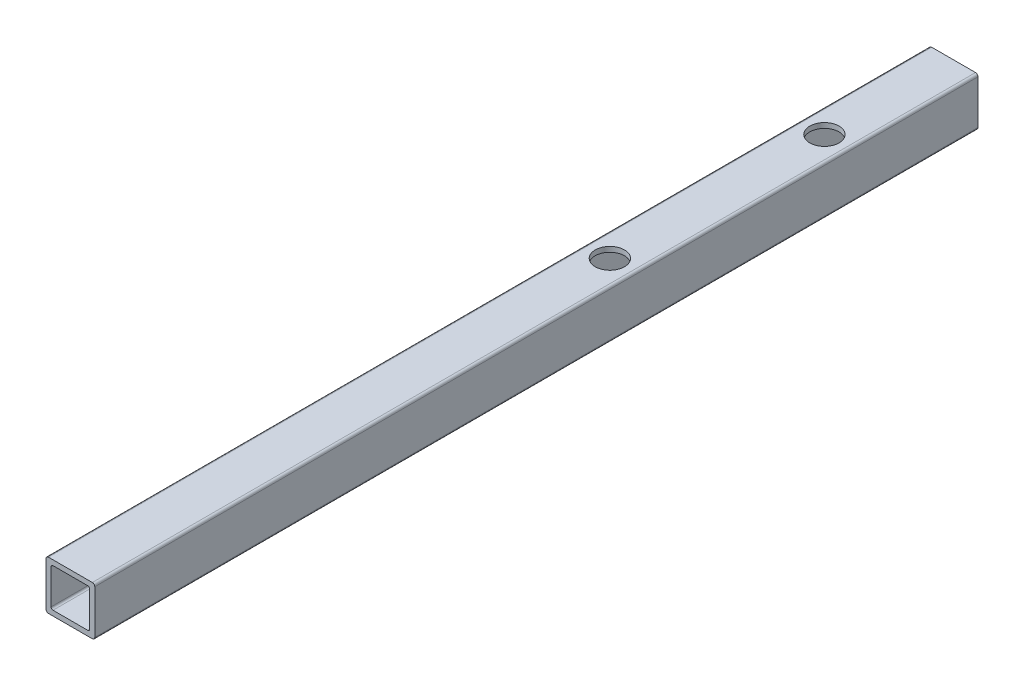
ISO-10303-21;
HEADER;
FILE_DESCRIPTION(('STEP AP214'),'2;1');
FILE_NAME('part.step','',(''),(''),'','','');
FILE_SCHEMA(('AUTOMOTIVE_DESIGN { 1 0 10303 214 1 1 1 1 }'));
ENDSEC;
DATA;
#1=APPLICATION_CONTEXT('core data for automotive mechanical design processes');
#2=APPLICATION_PROTOCOL_DEFINITION('international standard','automotive_design',2000,#1);
#3=PRODUCT_CONTEXT('',#1,'mechanical');
#4=PRODUCT('Part','Part','',(#3));
#5=PRODUCT_RELATED_PRODUCT_CATEGORY('part','',(#4));
#6=PRODUCT_DEFINITION_FORMATION('','',#4);
#7=PRODUCT_DEFINITION_CONTEXT('part definition',#1,'design');
#8=PRODUCT_DEFINITION('design','',#6,#7);
#9=PRODUCT_DEFINITION_SHAPE('','',#8);
#10=(LENGTH_UNIT() NAMED_UNIT(*) SI_UNIT(.MILLI.,.METRE.));
#11=(NAMED_UNIT(*) PLANE_ANGLE_UNIT() SI_UNIT($,.RADIAN.));
#12=(NAMED_UNIT(*) SI_UNIT($,.STERADIAN.) SOLID_ANGLE_UNIT());
#13=UNCERTAINTY_MEASURE_WITH_UNIT(LENGTH_MEASURE(1.E-05),#10,'distance_accuracy_value','');
#14=(GEOMETRIC_REPRESENTATION_CONTEXT(3) GLOBAL_UNCERTAINTY_ASSIGNED_CONTEXT((#13)) GLOBAL_UNIT_ASSIGNED_CONTEXT((#10,
#11,#12)) REPRESENTATION_CONTEXT('',''));
#15=CARTESIAN_POINT('',(0.,0.,0.));
#16=DIRECTION('',(0.,0.,1.));
#17=DIRECTION('',(1.,0.,0.));
#18=AXIS2_PLACEMENT_3D('',#15,#16,#17);
#19=CARTESIAN_POINT('',(7.14375,-7.14375,457.2));
#20=DIRECTION('',(0.,0.,-1.));
#21=DIRECTION('',(-1.,0.,0.));
#22=AXIS2_PLACEMENT_3D('',#19,#20,#21);
#23=CYLINDRICAL_SURFACE('',#22,0.79375);
#24=DIRECTION('',(0.,0.,-1.));
#25=VECTOR('',#24,1.);
#26=CARTESIAN_POINT('',(7.93749999999999,-7.14375,457.2));
#27=LINE('',#26,#25);
#28=CARTESIAN_POINT('',(7.93749999999999,-7.14375,-169.633508701963));
#29=VERTEX_POINT('',#28);
#30=CARTESIAN_POINT('',(7.93749999999999,-7.14375,-457.2));
#31=VERTEX_POINT('',#30);
#32=EDGE_CURVE('E41',#29,#31,#27,.T.);
#33=ORIENTED_EDGE('',*,*,#32,.F.);
#34=CARTESIAN_POINT('',(7.14375,-7.14375,-169.633508701963));
#35=DIRECTION('',(0.,0.,-1.));
#36=DIRECTION('',(-1.,0.,0.));
#37=AXIS2_PLACEMENT_3D('',#34,#35,#36);
#38=CIRCLE('',#37,0.79375);
#39=CARTESIAN_POINT('',(7.14375,-7.9375,-169.633508701963));
#40=VERTEX_POINT('',#39);
#41=EDGE_CURVE('E284',#29,#40,#38,.T.);
#42=ORIENTED_EDGE('',*,*,#41,.T.);
#43=DIRECTION('',(0.,0.,-1.));
#44=VECTOR('',#43,1.);
#45=CARTESIAN_POINT('',(7.14375,-7.9375,457.2));
#46=LINE('',#45,#44);
#47=CARTESIAN_POINT('',(7.14375,-7.9375,-457.2));
#48=VERTEX_POINT('',#47);
#49=EDGE_CURVE('E266',#40,#48,#46,.T.);
#50=ORIENTED_EDGE('',*,*,#49,.T.);
#51=CARTESIAN_POINT('',(7.14375,-7.14375,-457.2));
#52=DIRECTION('',(0.,0.,1.));
#53=DIRECTION('',(1.,0.,0.));
#54=AXIS2_PLACEMENT_3D('',#51,#52,#53);
#55=CIRCLE('',#54,0.79375);
#56=EDGE_CURVE('E229',#48,#31,#55,.T.);
#57=ORIENTED_EDGE('',*,*,#56,.T.);
#58=EDGE_LOOP('',(#33,#42,#50,#57));
#59=FACE_BOUND('',#58,.T.);
#60=ADVANCED_FACE('F34',(#59),#23,.T.);
#61=CARTESIAN_POINT('',(7.93749999999999,-7.14375,457.2));
#62=DIRECTION('',(-1.,0.,0.));
#63=DIRECTION('',(0.,0.,1.));
#64=AXIS2_PLACEMENT_3D('',#61,#62,#63);
#65=PLANE('',#64);
#66=DIRECTION('',(0.,0.,-1.));
#67=VECTOR('',#66,1.);
#68=CARTESIAN_POINT('',(7.93749999999999,7.14375,457.2));
#69=LINE('',#68,#67);
#70=CARTESIAN_POINT('',(7.93749999999999,7.14375,-169.633508701963));
#71=VERTEX_POINT('',#70);
#72=CARTESIAN_POINT('',(7.93749999999999,7.14375,-457.2));
#73=VERTEX_POINT('',#72);
#74=EDGE_CURVE('E176',#71,#73,#69,.T.);
#75=ORIENTED_EDGE('',*,*,#74,.F.);
#76=DIRECTION('',(0.,-1.,0.));
#77=VECTOR('',#76,1.);
#78=CARTESIAN_POINT('',(7.93749999999999,-7.14375,-169.633508701963));
#79=LINE('',#78,#77);
#80=EDGE_CURVE('E286',#71,#29,#79,.T.);
#81=ORIENTED_EDGE('',*,*,#80,.T.);
#82=ORIENTED_EDGE('',*,*,#32,.T.);
#83=DIRECTION('',(0.,1.,0.));
#84=VECTOR('',#83,1.);
#85=CARTESIAN_POINT('',(7.93749999999999,-7.14375,-457.2));
#86=LINE('',#85,#84);
#87=EDGE_CURVE('E232',#31,#73,#86,.T.);
#88=ORIENTED_EDGE('',*,*,#87,.T.);
#89=EDGE_LOOP('',(#75,#81,#82,#88));
#90=FACE_BOUND('',#89,.T.);
#91=ADVANCED_FACE('F303',(#90),#65,.F.);
#92=CARTESIAN_POINT('',(7.14375,7.14375,457.2));
#93=DIRECTION('',(0.,0.,-1.));
#94=DIRECTION('',(-1.,0.,0.));
#95=AXIS2_PLACEMENT_3D('',#92,#93,#94);
#96=CYLINDRICAL_SURFACE('',#95,0.79375);
#97=DIRECTION('',(0.,0.,-1.));
#98=VECTOR('',#97,1.);
#99=CARTESIAN_POINT('',(7.14375,7.9375,457.2));
#100=LINE('',#99,#98);
#101=CARTESIAN_POINT('',(7.14375,7.9375,-169.633508701963));
#102=VERTEX_POINT('',#101);
#103=CARTESIAN_POINT('',(7.14375,7.9375,-457.2));
#104=VERTEX_POINT('',#103);
#105=EDGE_CURVE('E169',#102,#104,#100,.T.);
#106=ORIENTED_EDGE('',*,*,#105,.F.);
#107=CARTESIAN_POINT('',(7.14375,7.14375,-169.633508701963));
#108=DIRECTION('',(0.,0.,-1.));
#109=DIRECTION('',(-1.,0.,0.));
#110=AXIS2_PLACEMENT_3D('',#107,#108,#109);
#111=CIRCLE('',#110,0.79375);
#112=EDGE_CURVE('E288',#102,#71,#111,.T.);
#113=ORIENTED_EDGE('',*,*,#112,.T.);
#114=ORIENTED_EDGE('',*,*,#74,.T.);
#115=CARTESIAN_POINT('',(7.14375,7.14375,-457.2));
#116=DIRECTION('',(0.,0.,1.));
#117=DIRECTION('',(1.,0.,0.));
#118=AXIS2_PLACEMENT_3D('',#115,#116,#117);
#119=CIRCLE('',#118,0.79375);
#120=EDGE_CURVE('E235',#73,#104,#119,.T.);
#121=ORIENTED_EDGE('',*,*,#120,.T.);
#122=EDGE_LOOP('',(#106,#113,#114,#121));
#123=FACE_BOUND('',#122,.T.);
#124=ADVANCED_FACE('F300',(#123),#96,.T.);
#125=CARTESIAN_POINT('',(7.14375,7.9375,457.2));
#126=DIRECTION('',(0.,-1.,0.));
#127=DIRECTION('',(0.,0.,-1.));
#128=AXIS2_PLACEMENT_3D('',#125,#126,#127);
#129=PLANE('',#128);
#130=CARTESIAN_POINT('',(7.21644966006352E-13,7.9375,-345.28125));
#131=DIRECTION('',(0.,1.,0.));
#132=DIRECTION('',(0.,0.,1.));
#133=AXIS2_PLACEMENT_3D('',#130,#131,#132);
#134=CIRCLE('',#133,4.76249999999999);
#135=CARTESIAN_POINT('',(7.21644966006352E-13,7.9375,-340.51875));
#136=VERTEX_POINT('',#135);
#137=EDGE_CURVE('E152',#136,#136,#134,.T.);
#138=ORIENTED_EDGE('',*,*,#137,.F.);
#139=EDGE_LOOP('',(#138));
#140=FACE_BOUND('',#139,.T.);
#141=CARTESIAN_POINT('',(0.,7.9375,-415.13125));
#142=DIRECTION('',(0.,-1.,0.));
#143=DIRECTION('',(0.,0.,-1.));
#144=AXIS2_PLACEMENT_3D('',#141,#142,#143);
#145=CIRCLE('',#144,4.7625);
#146=CARTESIAN_POINT('',(0.,7.9375,-419.89375));
#147=VERTEX_POINT('',#146);
#148=EDGE_CURVE('E196',#147,#147,#145,.T.);
#149=ORIENTED_EDGE('',*,*,#148,.T.);
#150=EDGE_LOOP('',(#149));
#151=FACE_BOUND('',#150,.T.);
#152=DIRECTION('',(0.,0.,-1.));
#153=VECTOR('',#152,1.);
#154=CARTESIAN_POINT('',(-7.14375,7.9375,457.2));
#155=LINE('',#154,#153);
#156=CARTESIAN_POINT('',(-7.14375,7.9375,-169.633508701963));
#157=VERTEX_POINT('',#156);
#158=CARTESIAN_POINT('',(-7.14375,7.9375,-457.2));
#159=VERTEX_POINT('',#158);
#160=EDGE_CURVE('E167',#157,#159,#155,.T.);
#161=ORIENTED_EDGE('',*,*,#160,.F.);
#162=DIRECTION('',(1.,0.,0.));
#163=VECTOR('',#162,1.);
#164=CARTESIAN_POINT('',(7.14375,7.9375,-169.633508701963));
#165=LINE('',#164,#163);
#166=EDGE_CURVE('E148',#157,#102,#165,.T.);
#167=ORIENTED_EDGE('',*,*,#166,.T.);
#168=ORIENTED_EDGE('',*,*,#105,.T.);
#169=DIRECTION('',(-1.,0.,0.));
#170=VECTOR('',#169,1.);
#171=CARTESIAN_POINT('',(7.14375,7.9375,-457.2));
#172=LINE('',#171,#170);
#173=EDGE_CURVE('E238',#104,#159,#172,.T.);
#174=ORIENTED_EDGE('',*,*,#173,.T.);
#175=EDGE_LOOP('',(#161,#167,#168,#174));
#176=FACE_BOUND('',#175,.T.);
#177=ADVANCED_FACE('F297',(#140,#151,#176),#129,.F.);
#178=CARTESIAN_POINT('',(-7.14375,7.14375,457.2));
#179=DIRECTION('',(0.,0.,-1.));
#180=DIRECTION('',(-1.,0.,0.));
#181=AXIS2_PLACEMENT_3D('',#178,#179,#180);
#182=CYLINDRICAL_SURFACE('',#181,0.793749999999999);
#183=DIRECTION('',(0.,0.,-1.));
#184=VECTOR('',#183,1.);
#185=CARTESIAN_POINT('',(-7.93750000000001,7.14375,457.2));
#186=LINE('',#185,#184);
#187=CARTESIAN_POINT('',(-7.93750000000001,7.14375,-169.633508701963));
#188=VERTEX_POINT('',#187);
#189=CARTESIAN_POINT('',(-7.93750000000001,7.14375,-457.2));
#190=VERTEX_POINT('',#189);
#191=EDGE_CURVE('E158',#188,#190,#186,.T.);
#192=ORIENTED_EDGE('',*,*,#191,.F.);
#193=CARTESIAN_POINT('',(-7.14375,7.14375,-169.633508701963));
#194=DIRECTION('',(0.,0.,-1.));
#195=DIRECTION('',(-1.,0.,0.));
#196=AXIS2_PLACEMENT_3D('',#193,#194,#195);
#197=CIRCLE('',#196,0.793749999999999);
#198=EDGE_CURVE('E143',#188,#157,#197,.T.);
#199=ORIENTED_EDGE('',*,*,#198,.T.);
#200=ORIENTED_EDGE('',*,*,#160,.T.);
#201=CARTESIAN_POINT('',(-7.14375,7.14375,-457.2));
#202=DIRECTION('',(0.,0.,1.));
#203=DIRECTION('',(1.,0.,0.));
#204=AXIS2_PLACEMENT_3D('',#201,#202,#203);
#205=CIRCLE('',#204,0.793749999999999);
#206=EDGE_CURVE('E166',#159,#190,#205,.T.);
#207=ORIENTED_EDGE('',*,*,#206,.T.);
#208=EDGE_LOOP('',(#192,#199,#200,#207));
#209=FACE_BOUND('',#208,.T.);
#210=ADVANCED_FACE('F164',(#209),#182,.T.);
#211=CARTESIAN_POINT('',(-7.93750000000001,-7.14375,457.2));
#212=DIRECTION('',(1.,0.,0.));
#213=DIRECTION('',(0.,0.,-1.));
#214=AXIS2_PLACEMENT_3D('',#211,#212,#213);
#215=PLANE('',#214);
#216=DIRECTION('',(0.,0.,-1.));
#217=VECTOR('',#216,1.);
#218=CARTESIAN_POINT('',(-7.93750000000001,-7.14375,457.2));
#219=LINE('',#218,#217);
#220=CARTESIAN_POINT('',(-7.93750000000001,-7.14375,-169.633508701963));
#221=VERTEX_POINT('',#220);
#222=CARTESIAN_POINT('',(-7.93750000000001,-7.14375,-457.2));
#223=VERTEX_POINT('',#222);
#224=EDGE_CURVE('E160',#221,#223,#219,.T.);
#225=ORIENTED_EDGE('',*,*,#224,.F.);
#226=DIRECTION('',(0.,-1.,0.));
#227=VECTOR('',#226,1.);
#228=CARTESIAN_POINT('',(-7.93750000000001,40.902895141827,-169.633508701963));
#229=LINE('',#228,#227);
#230=EDGE_CURVE('E146',#188,#221,#229,.T.);
#231=ORIENTED_EDGE('',*,*,#230,.F.);
#232=ORIENTED_EDGE('',*,*,#191,.T.);
#233=DIRECTION('',(0.,-1.,0.));
#234=VECTOR('',#233,1.);
#235=CARTESIAN_POINT('',(-7.93750000000001,-7.14375,-457.2));
#236=LINE('',#235,#234);
#237=EDGE_CURVE('E242',#190,#223,#236,.T.);
#238=ORIENTED_EDGE('',*,*,#237,.T.);
#239=EDGE_LOOP('',(#225,#231,#232,#238));
#240=FACE_BOUND('',#239,.T.);
#241=ADVANCED_FACE('F156',(#240),#215,.F.);
#242=CARTESIAN_POINT('',(-7.14375,-7.14375,457.2));
#243=DIRECTION('',(0.,0.,-1.));
#244=DIRECTION('',(-1.,0.,0.));
#245=AXIS2_PLACEMENT_3D('',#242,#243,#244);
#246=CYLINDRICAL_SURFACE('',#245,0.793749999999999);
#247=DIRECTION('',(0.,0.,-1.));
#248=VECTOR('',#247,1.);
#249=CARTESIAN_POINT('',(-7.14375,-7.9375,457.2));
#250=LINE('',#249,#248);
#251=CARTESIAN_POINT('',(-7.14375,-7.9375,-169.633508701963));
#252=VERTEX_POINT('',#251);
#253=CARTESIAN_POINT('',(-7.14375,-7.9375,-457.2));
#254=VERTEX_POINT('',#253);
#255=EDGE_CURVE('E171',#252,#254,#250,.T.);
#256=ORIENTED_EDGE('',*,*,#255,.F.);
#257=CARTESIAN_POINT('',(-7.14375,-7.14375,-169.633508701963));
#258=DIRECTION('',(0.,0.,-1.));
#259=DIRECTION('',(-1.,0.,0.));
#260=AXIS2_PLACEMENT_3D('',#257,#258,#259);
#261=CIRCLE('',#260,0.793749999999999);
#262=EDGE_CURVE('E48',#252,#221,#261,.T.);
#263=ORIENTED_EDGE('',*,*,#262,.T.);
#264=ORIENTED_EDGE('',*,*,#224,.T.);
#265=CARTESIAN_POINT('',(-7.14375,-7.14375,-457.2));
#266=DIRECTION('',(0.,0.,1.));
#267=DIRECTION('',(1.,0.,0.));
#268=AXIS2_PLACEMENT_3D('',#265,#266,#267);
#269=CIRCLE('',#268,0.793749999999999);
#270=EDGE_CURVE('E244',#223,#254,#269,.T.);
#271=ORIENTED_EDGE('',*,*,#270,.T.);
#272=EDGE_LOOP('',(#256,#263,#264,#271));
#273=FACE_BOUND('',#272,.T.);
#274=ADVANCED_FACE('F275',(#273),#246,.T.);
#275=CARTESIAN_POINT('',(7.14375,-7.9375,457.2));
#276=DIRECTION('',(0.,1.,0.));
#277=DIRECTION('',(0.,0.,1.));
#278=AXIS2_PLACEMENT_3D('',#275,#276,#277);
#279=PLANE('',#278);
#280=CARTESIAN_POINT('',(7.21644966006352E-13,-7.9375,-345.28125));
#281=DIRECTION('',(0.,1.,0.));
#282=DIRECTION('',(0.,0.,1.));
#283=AXIS2_PLACEMENT_3D('',#280,#281,#282);
#284=CIRCLE('',#283,4.7625);
#285=CARTESIAN_POINT('',(7.21644966006352E-13,-7.9375,-340.51875));
#286=VERTEX_POINT('',#285);
#287=EDGE_CURVE('E181',#286,#286,#284,.T.);
#288=ORIENTED_EDGE('',*,*,#287,.T.);
#289=EDGE_LOOP('',(#288));
#290=FACE_BOUND('',#289,.T.);
#291=CARTESIAN_POINT('',(0.,-7.9375,-415.13125));
#292=DIRECTION('',(0.,-1.,0.));
#293=DIRECTION('',(0.,0.,-1.));
#294=AXIS2_PLACEMENT_3D('',#291,#292,#293);
#295=CIRCLE('',#294,4.76249999999999);
#296=CARTESIAN_POINT('',(0.,-7.9375,-419.89375));
#297=VERTEX_POINT('',#296);
#298=EDGE_CURVE('E185',#297,#297,#295,.T.);
#299=ORIENTED_EDGE('',*,*,#298,.F.);
#300=EDGE_LOOP('',(#299));
#301=FACE_BOUND('',#300,.T.);
#302=ORIENTED_EDGE('',*,*,#49,.F.);
#303=DIRECTION('',(-1.,0.,0.));
#304=VECTOR('',#303,1.);
#305=CARTESIAN_POINT('',(7.14375,-7.9375,-169.633508701963));
#306=LINE('',#305,#304);
#307=EDGE_CURVE('E272',#40,#252,#306,.T.);
#308=ORIENTED_EDGE('',*,*,#307,.T.);
#309=ORIENTED_EDGE('',*,*,#255,.T.);
#310=DIRECTION('',(1.,0.,0.));
#311=VECTOR('',#310,1.);
#312=CARTESIAN_POINT('',(7.14375,-7.9375,-457.2));
#313=LINE('',#312,#311);
#314=EDGE_CURVE('E247',#254,#48,#313,.T.);
#315=ORIENTED_EDGE('',*,*,#314,.T.);
#316=EDGE_LOOP('',(#302,#308,#309,#315));
#317=FACE_BOUND('',#316,.T.);
#318=ADVANCED_FACE('F270',(#290,#301,#317),#279,.F.);
#319=CARTESIAN_POINT('',(5.65784999999999,5.65785,457.2));
#320=DIRECTION('',(0.,0.,-1.));
#321=DIRECTION('',(-1.,0.,0.));
#322=AXIS2_PLACEMENT_3D('',#319,#320,#321);
#323=CYLINDRICAL_SURFACE('',#322,0.62865);
#324=CARTESIAN_POINT('',(5.65784999999999,5.65785,-169.633508701963));
#325=DIRECTION('',(0.,0.,-1.));
#326=DIRECTION('',(-1.,0.,0.));
#327=AXIS2_PLACEMENT_3D('',#324,#325,#326);
#328=CIRCLE('',#327,0.62865);
#329=CARTESIAN_POINT('',(5.65784999999999,6.2865,-169.633508701963));
#330=VERTEX_POINT('',#329);
#331=CARTESIAN_POINT('',(6.2865,5.65785,-169.633508701963));
#332=VERTEX_POINT('',#331);
#333=EDGE_CURVE('E55',#330,#332,#328,.T.);
#334=ORIENTED_EDGE('',*,*,#333,.F.);
#335=DIRECTION('',(0.,0.,-1.));
#336=VECTOR('',#335,1.);
#337=CARTESIAN_POINT('',(5.65784999999999,6.2865,457.2));
#338=LINE('',#337,#336);
#339=CARTESIAN_POINT('',(5.65784999999999,6.2865,-457.2));
#340=VERTEX_POINT('',#339);
#341=EDGE_CURVE('E264',#330,#340,#338,.T.);
#342=ORIENTED_EDGE('',*,*,#341,.T.);
#343=CARTESIAN_POINT('',(5.65784999999999,5.65785,-457.2));
#344=DIRECTION('',(0.,0.,1.));
#345=DIRECTION('',(1.,0.,0.));
#346=AXIS2_PLACEMENT_3D('',#343,#344,#345);
#347=CIRCLE('',#346,0.62865);
#348=CARTESIAN_POINT('',(6.2865,5.65785,-457.2));
#349=VERTEX_POINT('',#348);
#350=EDGE_CURVE('E205',#349,#340,#347,.T.);
#351=ORIENTED_EDGE('',*,*,#350,.F.);
#352=DIRECTION('',(0.,0.,-1.));
#353=VECTOR('',#352,1.);
#354=CARTESIAN_POINT('',(6.2865,5.65785,457.2));
#355=LINE('',#354,#353);
#356=EDGE_CURVE('E250',#332,#349,#355,.T.);
#357=ORIENTED_EDGE('',*,*,#356,.F.);
#358=EDGE_LOOP('',(#334,#342,#351,#357));
#359=FACE_BOUND('',#358,.T.);
#360=ADVANCED_FACE('F322',(#359),#323,.F.);
#361=CARTESIAN_POINT('',(5.65784999999999,6.2865,457.2));
#362=DIRECTION('',(0.,-1.,0.));
#363=DIRECTION('',(0.,0.,-1.));
#364=AXIS2_PLACEMENT_3D('',#361,#362,#363);
#365=PLANE('',#364);
#366=DIRECTION('',(1.,0.,0.));
#367=VECTOR('',#366,1.);
#368=CARTESIAN_POINT('',(5.65784999999999,6.2865,-169.633508701963));
#369=LINE('',#368,#367);
#370=CARTESIAN_POINT('',(-5.65784999999999,6.2865,-169.633508701963));
#371=VERTEX_POINT('',#370);
#372=EDGE_CURVE('E505',#371,#330,#369,.T.);
#373=ORIENTED_EDGE('',*,*,#372,.F.);
#374=DIRECTION('',(0.,0.,-1.));
#375=VECTOR('',#374,1.);
#376=CARTESIAN_POINT('',(-5.65784999999999,6.2865,457.2));
#377=LINE('',#376,#375);
#378=CARTESIAN_POINT('',(-5.65784999999999,6.2865,-457.2));
#379=VERTEX_POINT('',#378);
#380=EDGE_CURVE('E262',#371,#379,#377,.T.);
#381=ORIENTED_EDGE('',*,*,#380,.T.);
#382=DIRECTION('',(-1.,0.,0.));
#383=VECTOR('',#382,1.);
#384=CARTESIAN_POINT('',(5.65784999999999,6.2865,-457.2));
#385=LINE('',#384,#383);
#386=EDGE_CURVE('E208',#340,#379,#385,.T.);
#387=ORIENTED_EDGE('',*,*,#386,.F.);
#388=ORIENTED_EDGE('',*,*,#341,.F.);
#389=EDGE_LOOP('',(#373,#381,#387,#388));
#390=FACE_BOUND('',#389,.T.);
#391=CARTESIAN_POINT('',(7.21644966006352E-13,6.2865,-345.28125));
#392=DIRECTION('',(0.,-1.,0.));
#393=DIRECTION('',(0.,0.,-1.));
#394=AXIS2_PLACEMENT_3D('',#391,#392,#393);
#395=CIRCLE('',#394,4.76249999999999);
#396=CARTESIAN_POINT('',(7.21644966006352E-13,6.2865,-350.04375));
#397=VERTEX_POINT('',#396);
#398=EDGE_CURVE('E178',#397,#397,#395,.T.);
#399=ORIENTED_EDGE('',*,*,#398,.F.);
#400=EDGE_LOOP('',(#399));
#401=FACE_BOUND('',#400,.T.);
#402=CARTESIAN_POINT('',(0.,6.2865,-415.13125));
#403=DIRECTION('',(0.,-1.,0.));
#404=DIRECTION('',(0.,0.,-1.));
#405=AXIS2_PLACEMENT_3D('',#402,#403,#404);
#406=CIRCLE('',#405,4.76249999999999);
#407=CARTESIAN_POINT('',(0.,6.2865,-419.89375));
#408=VERTEX_POINT('',#407);
#409=EDGE_CURVE('E202',#408,#408,#406,.T.);
#410=ORIENTED_EDGE('',*,*,#409,.F.);
#411=EDGE_LOOP('',(#410));
#412=FACE_BOUND('',#411,.T.);
#413=ADVANCED_FACE('F325',(#390,#401,#412),#365,.T.);
#414=CARTESIAN_POINT('',(-5.65784999999999,5.65785,457.2));
#415=DIRECTION('',(0.,0.,-1.));
#416=DIRECTION('',(-1.,0.,0.));
#417=AXIS2_PLACEMENT_3D('',#414,#415,#416);
#418=CYLINDRICAL_SURFACE('',#417,0.628650000000002);
#419=CARTESIAN_POINT('',(-5.65784999999999,5.65785,-169.633508701963));
#420=DIRECTION('',(0.,0.,-1.));
#421=DIRECTION('',(-1.,0.,0.));
#422=AXIS2_PLACEMENT_3D('',#419,#420,#421);
#423=CIRCLE('',#422,0.628650000000002);
#424=CARTESIAN_POINT('',(-6.2865,5.65785,-169.633508701963));
#425=VERTEX_POINT('',#424);
#426=EDGE_CURVE('E486',#425,#371,#423,.T.);
#427=ORIENTED_EDGE('',*,*,#426,.F.);
#428=DIRECTION('',(0.,0.,-1.));
#429=VECTOR('',#428,1.);
#430=CARTESIAN_POINT('',(-6.2865,5.65785,457.2));
#431=LINE('',#430,#429);
#432=CARTESIAN_POINT('',(-6.2865,5.65785,-457.2));
#433=VERTEX_POINT('',#432);
#434=EDGE_CURVE('E260',#425,#433,#431,.T.);
#435=ORIENTED_EDGE('',*,*,#434,.T.);
#436=CARTESIAN_POINT('',(-5.65784999999999,5.65785,-457.2));
#437=DIRECTION('',(0.,0.,1.));
#438=DIRECTION('',(1.,0.,0.));
#439=AXIS2_PLACEMENT_3D('',#436,#437,#438);
#440=CIRCLE('',#439,0.628650000000002);
#441=EDGE_CURVE('E211',#379,#433,#440,.T.);
#442=ORIENTED_EDGE('',*,*,#441,.F.);
#443=ORIENTED_EDGE('',*,*,#380,.F.);
#444=EDGE_LOOP('',(#427,#435,#442,#443));
#445=FACE_BOUND('',#444,.T.);
#446=ADVANCED_FACE('F329',(#445),#418,.F.);
#447=CARTESIAN_POINT('',(-6.2865,5.65785,457.2));
#448=DIRECTION('',(1.,0.,0.));
#449=DIRECTION('',(0.,1.,0.));
#450=AXIS2_PLACEMENT_3D('',#447,#448,#449);
#451=PLANE('',#450);
#452=DIRECTION('',(0.,1.,0.));
#453=VECTOR('',#452,1.);
#454=CARTESIAN_POINT('',(-6.2865,5.65785,-169.633508701963));
#455=LINE('',#454,#453);
#456=CARTESIAN_POINT('',(-6.2865,-5.65785000000001,-169.633508701963));
#457=VERTEX_POINT('',#456);
#458=EDGE_CURVE('E490',#457,#425,#455,.T.);
#459=ORIENTED_EDGE('',*,*,#458,.F.);
#460=DIRECTION('',(0.,0.,-1.));
#461=VECTOR('',#460,1.);
#462=CARTESIAN_POINT('',(-6.2865,-5.65785000000001,457.2));
#463=LINE('',#462,#461);
#464=CARTESIAN_POINT('',(-6.2865,-5.65785000000001,-457.2));
#465=VERTEX_POINT('',#464);
#466=EDGE_CURVE('E258',#457,#465,#463,.T.);
#467=ORIENTED_EDGE('',*,*,#466,.T.);
#468=DIRECTION('',(0.,-1.,0.));
#469=VECTOR('',#468,1.);
#470=CARTESIAN_POINT('',(-6.2865,5.65785,-457.2));
#471=LINE('',#470,#469);
#472=EDGE_CURVE('E214',#433,#465,#471,.T.);
#473=ORIENTED_EDGE('',*,*,#472,.F.);
#474=ORIENTED_EDGE('',*,*,#434,.F.);
#475=EDGE_LOOP('',(#459,#467,#473,#474));
#476=FACE_BOUND('',#475,.T.);
#477=ADVANCED_FACE('F333',(#476),#451,.T.);
#478=CARTESIAN_POINT('',(-5.65784999999999,-5.65785000000001,457.2));
#479=DIRECTION('',(0.,0.,-1.));
#480=DIRECTION('',(-1.,0.,0.));
#481=AXIS2_PLACEMENT_3D('',#478,#479,#480);
#482=CYLINDRICAL_SURFACE('',#481,0.62865);
#483=CARTESIAN_POINT('',(-5.65784999999999,-5.65785000000001,-169.633508701963));
#484=DIRECTION('',(0.,0.,-1.));
#485=DIRECTION('',(-1.,0.,0.));
#486=AXIS2_PLACEMENT_3D('',#483,#484,#485);
#487=CIRCLE('',#486,0.62865);
#488=CARTESIAN_POINT('',(-5.65784999999999,-6.2865,-169.633508701963));
#489=VERTEX_POINT('',#488);
#490=EDGE_CURVE('E499',#489,#457,#487,.T.);
#491=ORIENTED_EDGE('',*,*,#490,.F.);
#492=DIRECTION('',(0.,0.,-1.));
#493=VECTOR('',#492,1.);
#494=CARTESIAN_POINT('',(-5.65784999999999,-6.2865,457.2));
#495=LINE('',#494,#493);
#496=CARTESIAN_POINT('',(-5.65784999999999,-6.2865,-457.2));
#497=VERTEX_POINT('',#496);
#498=EDGE_CURVE('E256',#489,#497,#495,.T.);
#499=ORIENTED_EDGE('',*,*,#498,.T.);
#500=CARTESIAN_POINT('',(-5.65784999999999,-5.65785000000001,-457.2));
#501=DIRECTION('',(0.,0.,1.));
#502=DIRECTION('',(1.,0.,0.));
#503=AXIS2_PLACEMENT_3D('',#500,#501,#502);
#504=CIRCLE('',#503,0.62865);
#505=EDGE_CURVE('E217',#465,#497,#504,.T.);
#506=ORIENTED_EDGE('',*,*,#505,.F.);
#507=ORIENTED_EDGE('',*,*,#466,.F.);
#508=EDGE_LOOP('',(#491,#499,#506,#507));
#509=FACE_BOUND('',#508,.T.);
#510=ADVANCED_FACE('F337',(#509),#482,.F.);
#511=CARTESIAN_POINT('',(5.65784999999999,-6.2865,457.2));
#512=DIRECTION('',(0.,1.,0.));
#513=DIRECTION('',(-1.,0.,0.));
#514=AXIS2_PLACEMENT_3D('',#511,#512,#513);
#515=PLANE('',#514);
#516=DIRECTION('',(-1.,0.,0.));
#517=VECTOR('',#516,1.);
#518=CARTESIAN_POINT('',(5.65784999999999,-6.2865,-169.633508701963));
#519=LINE('',#518,#517);
#520=CARTESIAN_POINT('',(5.65784999999999,-6.2865,-169.633508701963));
#521=VERTEX_POINT('',#520);
#522=EDGE_CURVE('E496',#521,#489,#519,.T.);
#523=ORIENTED_EDGE('',*,*,#522,.F.);
#524=DIRECTION('',(0.,0.,-1.));
#525=VECTOR('',#524,1.);
#526=CARTESIAN_POINT('',(5.65784999999999,-6.2865,457.2));
#527=LINE('',#526,#525);
#528=CARTESIAN_POINT('',(5.65784999999999,-6.2865,-457.2));
#529=VERTEX_POINT('',#528);
#530=EDGE_CURVE('E254',#521,#529,#527,.T.);
#531=ORIENTED_EDGE('',*,*,#530,.T.);
#532=DIRECTION('',(1.,0.,0.));
#533=VECTOR('',#532,1.);
#534=CARTESIAN_POINT('',(5.65784999999999,-6.2865,-457.2));
#535=LINE('',#534,#533);
#536=EDGE_CURVE('E220',#497,#529,#535,.T.);
#537=ORIENTED_EDGE('',*,*,#536,.F.);
#538=ORIENTED_EDGE('',*,*,#498,.F.);
#539=EDGE_LOOP('',(#523,#531,#537,#538));
#540=FACE_BOUND('',#539,.T.);
#541=CARTESIAN_POINT('',(7.21644966006352E-13,-6.2865,-345.28125));
#542=DIRECTION('',(0.,1.,0.));
#543=DIRECTION('',(-1.,0.,0.));
#544=AXIS2_PLACEMENT_3D('',#541,#542,#543);
#545=CIRCLE('',#544,4.76249999999999);
#546=CARTESIAN_POINT('',(-4.76249999999927,-6.2865,-345.28125));
#547=VERTEX_POINT('',#546);
#548=EDGE_CURVE('E180',#547,#547,#545,.T.);
#549=ORIENTED_EDGE('',*,*,#548,.F.);
#550=EDGE_LOOP('',(#549));
#551=FACE_BOUND('',#550,.T.);
#552=CARTESIAN_POINT('',(0.,-6.2865,-415.13125));
#553=DIRECTION('',(0.,1.,0.));
#554=DIRECTION('',(-1.,0.,0.));
#555=AXIS2_PLACEMENT_3D('',#552,#553,#554);
#556=CIRCLE('',#555,4.76249999999999);
#557=CARTESIAN_POINT('',(-4.76249999999999,-6.2865,-415.13125));
#558=VERTEX_POINT('',#557);
#559=EDGE_CURVE('E199',#558,#558,#556,.T.);
#560=ORIENTED_EDGE('',*,*,#559,.F.);
#561=EDGE_LOOP('',(#560));
#562=FACE_BOUND('',#561,.T.);
#563=ADVANCED_FACE('F341',(#540,#551,#562),#515,.T.);
#564=CARTESIAN_POINT('',(5.65784999999999,-5.65785000000001,457.2));
#565=DIRECTION('',(0.,0.,-1.));
#566=DIRECTION('',(-1.,0.,0.));
#567=AXIS2_PLACEMENT_3D('',#564,#565,#566);
#568=CYLINDRICAL_SURFACE('',#567,0.62865);
#569=CARTESIAN_POINT('',(5.65784999999999,-5.65785000000001,-169.633508701963));
#570=DIRECTION('',(0.,0.,-1.));
#571=DIRECTION('',(-1.,0.,0.));
#572=AXIS2_PLACEMENT_3D('',#569,#570,#571);
#573=CIRCLE('',#572,0.62865);
#574=CARTESIAN_POINT('',(6.2865,-5.65785000000001,-169.633508701963));
#575=VERTEX_POINT('',#574);
#576=EDGE_CURVE('E161',#575,#521,#573,.T.);
#577=ORIENTED_EDGE('',*,*,#576,.F.);
#578=DIRECTION('',(0.,0.,-1.));
#579=VECTOR('',#578,1.);
#580=CARTESIAN_POINT('',(6.2865,-5.65785000000001,457.2));
#581=LINE('',#580,#579);
#582=CARTESIAN_POINT('',(6.2865,-5.65785000000001,-457.2));
#583=VERTEX_POINT('',#582);
#584=EDGE_CURVE('E252',#575,#583,#581,.T.);
#585=ORIENTED_EDGE('',*,*,#584,.T.);
#586=CARTESIAN_POINT('',(5.65784999999999,-5.65785000000001,-457.2));
#587=DIRECTION('',(0.,0.,1.));
#588=DIRECTION('',(1.,0.,0.));
#589=AXIS2_PLACEMENT_3D('',#586,#587,#588);
#590=CIRCLE('',#589,0.62865);
#591=EDGE_CURVE('E223',#529,#583,#590,.T.);
#592=ORIENTED_EDGE('',*,*,#591,.F.);
#593=ORIENTED_EDGE('',*,*,#530,.F.);
#594=EDGE_LOOP('',(#577,#585,#592,#593));
#595=FACE_BOUND('',#594,.T.);
#596=ADVANCED_FACE('F345',(#595),#568,.F.);
#597=CARTESIAN_POINT('',(6.2865,5.65785,457.2));
#598=DIRECTION('',(-1.,0.,0.));
#599=DIRECTION('',(0.,0.,1.));
#600=AXIS2_PLACEMENT_3D('',#597,#598,#599);
#601=PLANE('',#600);
#602=DIRECTION('',(0.,-1.,0.));
#603=VECTOR('',#602,1.);
#604=CARTESIAN_POINT('',(6.2865,5.65785,-169.633508701963));
#605=LINE('',#604,#603);
#606=EDGE_CURVE('E11',#332,#575,#605,.T.);
#607=ORIENTED_EDGE('',*,*,#606,.F.);
#608=ORIENTED_EDGE('',*,*,#356,.T.);
#609=DIRECTION('',(0.,1.,0.));
#610=VECTOR('',#609,1.);
#611=CARTESIAN_POINT('',(6.2865,5.65785,-457.2));
#612=LINE('',#611,#610);
#613=EDGE_CURVE('E226',#583,#349,#612,.T.);
#614=ORIENTED_EDGE('',*,*,#613,.F.);
#615=ORIENTED_EDGE('',*,*,#584,.F.);
#616=EDGE_LOOP('',(#607,#608,#614,#615));
#617=FACE_BOUND('',#616,.T.);
#618=ADVANCED_FACE('F349',(#617),#601,.T.);
#619=CARTESIAN_POINT('',(7.14375,-7.14375,-457.2));
#620=DIRECTION('',(0.,0.,1.));
#621=DIRECTION('',(1.,0.,0.));
#622=AXIS2_PLACEMENT_3D('',#619,#620,#621);
#623=PLANE('',#622);
#624=ORIENTED_EDGE('',*,*,#613,.T.);
#625=ORIENTED_EDGE('',*,*,#350,.T.);
#626=ORIENTED_EDGE('',*,*,#386,.T.);
#627=ORIENTED_EDGE('',*,*,#441,.T.);
#628=ORIENTED_EDGE('',*,*,#472,.T.);
#629=ORIENTED_EDGE('',*,*,#505,.T.);
#630=ORIENTED_EDGE('',*,*,#536,.T.);
#631=ORIENTED_EDGE('',*,*,#591,.T.);
#632=EDGE_LOOP('',(#624,#625,#626,#627,#628,#629,#630,#631));
#633=FACE_BOUND('',#632,.T.);
#634=ORIENTED_EDGE('',*,*,#56,.F.);
#635=ORIENTED_EDGE('',*,*,#314,.F.);
#636=ORIENTED_EDGE('',*,*,#270,.F.);
#637=ORIENTED_EDGE('',*,*,#237,.F.);
#638=ORIENTED_EDGE('',*,*,#206,.F.);
#639=ORIENTED_EDGE('',*,*,#173,.F.);
#640=ORIENTED_EDGE('',*,*,#120,.F.);
#641=ORIENTED_EDGE('',*,*,#87,.F.);
#642=EDGE_LOOP('',(#634,#635,#636,#637,#638,#639,#640,#641));
#643=FACE_BOUND('',#642,.T.);
#644=ADVANCED_FACE('F278',(#633,#643),#623,.F.);
#645=CARTESIAN_POINT('',(0.,-7.9375,-415.13125));
#646=DIRECTION('',(0.,-1.,0.));
#647=DIRECTION('',(0.,0.,-1.));
#648=AXIS2_PLACEMENT_3D('',#645,#646,#647);
#649=CYLINDRICAL_SURFACE('',#648,4.76249999999999);
#650=ORIENTED_EDGE('',*,*,#559,.T.);
#651=EDGE_LOOP('',(#650));
#652=FACE_BOUND('',#651,.T.);
#653=ORIENTED_EDGE('',*,*,#298,.T.);
#654=EDGE_LOOP('',(#653));
#655=FACE_BOUND('',#654,.T.);
#656=ADVANCED_FACE('F356',(#652,#655),#649,.F.);
#657=ORIENTED_EDGE('',*,*,#409,.T.);
#658=EDGE_LOOP('',(#657));
#659=FACE_BOUND('',#658,.T.);
#660=ORIENTED_EDGE('',*,*,#148,.F.);
#661=EDGE_LOOP('',(#660));
#662=FACE_BOUND('',#661,.T.);
#663=ADVANCED_FACE('F360',(#659,#662),#649,.F.);
#664=CARTESIAN_POINT('',(7.21644966006352E-13,7.9375,-345.28125));
#665=DIRECTION('',(0.,1.,0.));
#666=DIRECTION('',(0.,0.,1.));
#667=AXIS2_PLACEMENT_3D('',#664,#665,#666);
#668=CYLINDRICAL_SURFACE('',#667,4.76249999999999);
#669=ORIENTED_EDGE('',*,*,#398,.T.);
#670=EDGE_LOOP('',(#669));
#671=FACE_BOUND('',#670,.T.);
#672=ORIENTED_EDGE('',*,*,#137,.T.);
#673=EDGE_LOOP('',(#672));
#674=FACE_BOUND('',#673,.T.);
#675=ADVANCED_FACE('F362',(#671,#674),#668,.F.);
#676=ORIENTED_EDGE('',*,*,#548,.T.);
#677=EDGE_LOOP('',(#676));
#678=FACE_BOUND('',#677,.T.);
#679=ORIENTED_EDGE('',*,*,#287,.F.);
#680=EDGE_LOOP('',(#679));
#681=FACE_BOUND('',#680,.T.);
#682=ADVANCED_FACE('F365',(#678,#681),#668,.F.);
#683=CARTESIAN_POINT('',(25.0825,40.902895141827,-169.633508701963));
#684=DIRECTION('',(0.,0.,-1.));
#685=DIRECTION('',(-1.,0.,0.));
#686=AXIS2_PLACEMENT_3D('',#683,#684,#685);
#687=PLANE('',#686);
#688=ORIENTED_EDGE('',*,*,#333,.T.);
#689=ORIENTED_EDGE('',*,*,#606,.T.);
#690=ORIENTED_EDGE('',*,*,#576,.T.);
#691=ORIENTED_EDGE('',*,*,#522,.T.);
#692=ORIENTED_EDGE('',*,*,#490,.T.);
#693=ORIENTED_EDGE('',*,*,#458,.T.);
#694=ORIENTED_EDGE('',*,*,#426,.T.);
#695=ORIENTED_EDGE('',*,*,#372,.T.);
#696=EDGE_LOOP('',(#688,#689,#690,#691,#692,#693,#694,#695));
#697=FACE_BOUND('',#696,.T.);
#698=ORIENTED_EDGE('',*,*,#230,.T.);
#699=ORIENTED_EDGE('',*,*,#262,.F.);
#700=ORIENTED_EDGE('',*,*,#307,.F.);
#701=ORIENTED_EDGE('',*,*,#41,.F.);
#702=ORIENTED_EDGE('',*,*,#80,.F.);
#703=ORIENTED_EDGE('',*,*,#112,.F.);
#704=ORIENTED_EDGE('',*,*,#166,.F.);
#705=ORIENTED_EDGE('',*,*,#198,.F.);
#706=EDGE_LOOP('',(#698,#699,#700,#701,#702,#703,#704,#705));
#707=FACE_BOUND('',#706,.T.);
#708=ADVANCED_FACE('F145',(#697,#707),#687,.F.);
#709=CLOSED_SHELL('',(#60,#91,#124,#177,#210,#241,#274,#318,#360,#413,#446,#477,#510,#563,#596,
#618,#644,#656,#663,#675,#682,#708));
#710=MANIFOLD_SOLID_BREP('B2',#709);
#711=ADVANCED_BREP_SHAPE_REPRESENTATION('',(#18,#710),#14);
#712=SHAPE_DEFINITION_REPRESENTATION(#9,#711);
ENDSEC;
END-ISO-10303-21;
